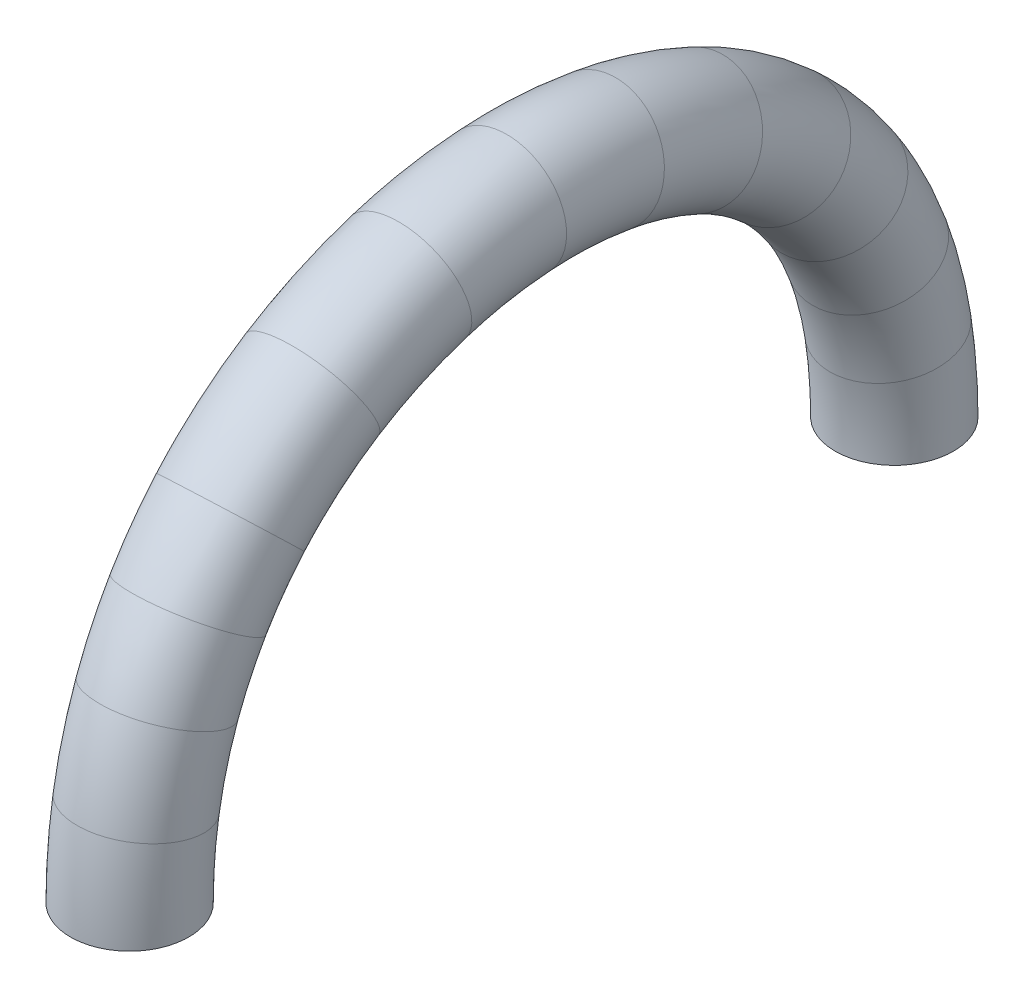
ISO-10303-21;
HEADER;
FILE_DESCRIPTION(('STEP AP214'),'2;1');
FILE_NAME('part.step','',(''),(''),'','','');
FILE_SCHEMA(('AUTOMOTIVE_DESIGN { 1 0 10303 214 1 1 1 1 }'));
ENDSEC;
DATA;
#1=APPLICATION_CONTEXT('core data for automotive mechanical design processes');
#2=APPLICATION_PROTOCOL_DEFINITION('international standard','automotive_design',2000,#1);
#3=PRODUCT_CONTEXT('',#1,'mechanical');
#4=PRODUCT('Part','Part','',(#3));
#5=PRODUCT_RELATED_PRODUCT_CATEGORY('part','',(#4));
#6=PRODUCT_DEFINITION_FORMATION('','',#4);
#7=PRODUCT_DEFINITION_CONTEXT('part definition',#1,'design');
#8=PRODUCT_DEFINITION('design','',#6,#7);
#9=PRODUCT_DEFINITION_SHAPE('','',#8);
#10=(LENGTH_UNIT() NAMED_UNIT(*) SI_UNIT(.MILLI.,.METRE.));
#11=(NAMED_UNIT(*) PLANE_ANGLE_UNIT() SI_UNIT($,.RADIAN.));
#12=(NAMED_UNIT(*) SI_UNIT($,.STERADIAN.) SOLID_ANGLE_UNIT());
#13=UNCERTAINTY_MEASURE_WITH_UNIT(LENGTH_MEASURE(1.E-05),#10,'distance_accuracy_value','');
#14=(GEOMETRIC_REPRESENTATION_CONTEXT(3) GLOBAL_UNCERTAINTY_ASSIGNED_CONTEXT((#13)) GLOBAL_UNIT_ASSIGNED_CONTEXT((#10,
#11,#12)) REPRESENTATION_CONTEXT('',''));
#15=CARTESIAN_POINT('',(0.,0.,0.));
#16=DIRECTION('',(0.,0.,1.));
#17=DIRECTION('',(1.,0.,0.));
#18=AXIS2_PLACEMENT_3D('',#15,#16,#17);
#19=CARTESIAN_POINT('',(-5.24968353162595,125.049999999714,248.374757540876));
#20=DIRECTION('',(0.,1.,0.));
#21=DIRECTION('',(0.,0.,-1.));
#22=AXIS2_PLACEMENT_3D('',#19,#20,#21);
#23=PLANE('',#22);
#24=CARTESIAN_POINT('',(-5.24968353162595,125.049999999714,248.374757540876));
#25=DIRECTION('',(0.,1.,0.));
#26=DIRECTION('',(0.,0.,1.));
#27=AXIS2_PLACEMENT_3D('',#24,#25,#26);
#28=CIRCLE('',#27,0.77);
#29=CARTESIAN_POINT('',(-5.24968353162595,125.049999999714,249.144757540876));
#30=VERTEX_POINT('',#29);
#31=EDGE_CURVE('E11',#30,#30,#28,.T.);
#32=ORIENTED_EDGE('',*,*,#31,.F.);
#33=EDGE_LOOP('',(#32));
#34=FACE_BOUND('',#33,.T.);
#35=ADVANCED_FACE('F43',(#34),#23,.F.);
#36=CARTESIAN_POINT('',(-4.74999999999908,125.049999999714,258.824757540733));
#37=DIRECTION('',(0.,-1.,0.));
#38=DIRECTION('',(0.,0.,-1.));
#39=AXIS2_PLACEMENT_3D('',#36,#37,#38);
#40=PLANE('',#39);
#41=CARTESIAN_POINT('',(-4.74999999999908,125.049999999714,258.824757540733));
#42=DIRECTION('',(0.,-1.,0.));
#43=DIRECTION('',(-0.0954150521681491,0.,-0.995437576053742));
#44=AXIS2_PLACEMENT_3D('',#41,#42,#43);
#45=CIRCLE('',#44,0.77);
#46=CARTESIAN_POINT('',(-4.82346959016856,125.049999999714,258.058270607171));
#47=VERTEX_POINT('',#46);
#48=EDGE_CURVE('E101',#47,#47,#45,.T.);
#49=ORIENTED_EDGE('',*,*,#48,.T.);
#50=EDGE_LOOP('',(#49));
#51=FACE_BOUND('',#50,.T.);
#52=ADVANCED_FACE('F152',(#51),#40,.T.);
#53=CARTESIAN_POINT('',(-4.93879007433618,125.049999999714,254.876546018987));
#54=DIRECTION('',(-0.998858742779414,0.,0.047762034851219));
#55=DIRECTION('',(-0.0477620348512189,0.,-0.998858742779414));
#56=AXIS2_PLACEMENT_3D('',#53,#54,#55);
#57=TOROIDAL_SURFACE('',#56,6.50921716920588,0.77);
#58=ORIENTED_EDGE('',*,*,#31,.T.);
#59=EDGE_LOOP('',(#58));
#60=FACE_BOUND('',#59,.T.);
#61=CARTESIAN_POINT('',(-5.24551350802851,126.112541783809,248.461966231646));
#62=DIRECTION('',(0.00779650707659332,0.986586968944942,0.163050198360616));
#63=DIRECTION('',(-0.000639902528925623,-0.163050198360616,0.986617566911981));
#64=AXIS2_PLACEMENT_3D('',#61,#62,#63);
#65=CIRCLE('',#64,0.77);
#66=CARTESIAN_POINT('',(-5.24600623297578,125.986993131071,249.221661758169));
#67=VERTEX_POINT('',#66);
#68=EDGE_CURVE('E53',#67,#67,#65,.T.);
#69=ORIENTED_EDGE('',*,*,#68,.F.);
#70=EDGE_LOOP('',(#69));
#71=FACE_BOUND('',#70,.T.);
#72=ADVANCED_FACE('F147',(#60,#71),#57,.T.);
#73=CARTESIAN_POINT('',(-5.00029378322637,125.263059236127,253.590304393611));
#74=DIRECTION('',(0.998858742779414,0.,-0.0477620348512175));
#75=DIRECTION('',(0.0477620348512175,0.,0.998858742779414));
#76=AXIS2_PLACEMENT_3D('',#73,#74,#75);
#77=TOROIDAL_SURFACE('',#76,5.20399900227804,0.77);
#78=CARTESIAN_POINT('',(-5.23213409946634,127.139118596369,248.741772970558));
#79=DIRECTION('',(0.0172183761963776,0.932757897281692,0.360091977944243));
#80=DIRECTION('',(-0.00320795436938125,-0.360091977944243,0.932911290771511));
#81=AXIS2_PLACEMENT_3D('',#78,#79,#80);
#82=CIRCLE('',#81,0.77);
#83=CARTESIAN_POINT('',(-5.23460422433076,126.861847773352,249.460114664453));
#84=VERTEX_POINT('',#83);
#85=EDGE_CURVE('E120',#84,#84,#82,.T.);
#86=ORIENTED_EDGE('',*,*,#85,.F.);
#87=EDGE_LOOP('',(#86));
#88=FACE_BOUND('',#87,.T.);
#89=ORIENTED_EDGE('',*,*,#68,.T.);
#90=EDGE_LOOP('',(#89));
#91=FACE_BOUND('',#90,.T.);
#92=ADVANCED_FACE('F141',(#88,#91),#77,.T.);
#93=CARTESIAN_POINT('',(-5.01765005362938,125.403506739291,253.227328601475));
#94=DIRECTION('',(0.998858742779413,0.,-0.0477620348512268));
#95=DIRECTION('',(0.0477620348512268,0.,0.998858742779413));
#96=AXIS2_PLACEMENT_3D('',#93,#94,#95);
#97=TOROIDAL_SURFACE('',#96,4.81441182725285,0.77);
#98=CARTESIAN_POINT('',(-5.20792832750184,128.106699598488,249.247994010508));
#99=DIRECTION('',(0.0268173966380888,0.827490743859725,0.560838565064882));
#100=DIRECTION('',(-0.00822998983705703,-0.560838565064882,0.827884274040307));
#101=AXIS2_PLACEMENT_3D('',#98,#99,#100);
#102=CIRCLE('',#101,0.77);
#103=CARTESIAN_POINT('',(-5.21426541967637,127.674853903388,249.885464901519));
#104=VERTEX_POINT('',#103);
#105=EDGE_CURVE('E47',#104,#104,#102,.T.);
#106=ORIENTED_EDGE('',*,*,#105,.F.);
#107=EDGE_LOOP('',(#106));
#108=FACE_BOUND('',#107,.T.);
#109=ORIENTED_EDGE('',*,*,#85,.T.);
#110=EDGE_LOOP('',(#109));
#111=FACE_BOUND('',#110,.T.);
#112=ADVANCED_FACE('F136',(#108,#111),#97,.T.);
#113=CARTESIAN_POINT('',(-5.02390569919261,125.492377717947,253.096502804752));
#114=DIRECTION('',(0.998858742779414,0.,-0.0477620348512201));
#115=DIRECTION('',(0.0477620348512201,0.,0.998858742779414));
#116=AXIS2_PLACEMENT_3D('',#113,#114,#115);
#117=TOROIDAL_SURFACE('',#116,4.65613178101523,0.77);
#118=CARTESIAN_POINT('',(-5.17379235828874,128.932041186004,249.961887616548));
#119=DIRECTION('',(0.0352836504988217,0.673992237637731,0.737895336488557));
#120=DIRECTION('',(-0.0155530238265091,-0.737895336488557,0.674735930448565));
#121=AXIS2_PLACEMENT_3D('',#118,#119,#120);
#122=CIRCLE('',#121,0.77);
#123=CARTESIAN_POINT('',(-5.18576818663515,128.363861776908,250.481434282993));
#124=VERTEX_POINT('',#123);
#125=EDGE_CURVE('E104',#124,#124,#122,.T.);
#126=ORIENTED_EDGE('',*,*,#125,.F.);
#127=EDGE_LOOP('',(#126));
#128=FACE_BOUND('',#127,.T.);
#129=ORIENTED_EDGE('',*,*,#105,.T.);
#130=EDGE_LOOP('',(#129));
#131=FACE_BOUND('',#130,.T.);
#132=ADVANCED_FACE('F45',(#128,#131),#117,.T.);
#133=CARTESIAN_POINT('',(-5.01684522330669,125.330350883015,253.244160208563));
#134=DIRECTION('',(0.998858742779414,0.,-0.0477620348512181));
#135=DIRECTION('',(0.0477620348512181,0.,0.998858742779414));
#136=AXIS2_PLACEMENT_3D('',#133,#134,#135);
#137=TOROIDAL_SURFACE('',#136,4.87546088181558,0.77);
#138=CARTESIAN_POINT('',(-5.11995137720517,129.701841452362,251.08787680111));
#139=DIRECTION('',(0.0428249328599185,0.442778056370422,0.895607959948087));
#140=DIRECTION('',(-0.0265836804103278,-0.895607959948087,0.44404919773992));
#141=AXIS2_PLACEMENT_3D('',#138,#139,#140);
#142=CIRCLE('',#141,0.77);
#143=CARTESIAN_POINT('',(-5.14042081112112,129.012223323202,251.42979468337));
#144=VERTEX_POINT('',#143);
#145=EDGE_CURVE('E106',#144,#144,#142,.T.);
#146=ORIENTED_EDGE('',*,*,#145,.F.);
#147=EDGE_LOOP('',(#146));
#148=FACE_BOUND('',#147,.T.);
#149=ORIENTED_EDGE('',*,*,#125,.T.);
#150=EDGE_LOOP('',(#149));
#151=FACE_BOUND('',#150,.T.);
#152=ADVANCED_FACE('F128',(#148,#151),#137,.T.);
#153=CARTESIAN_POINT('',(-5.00256428061136,124.724868048542,253.542820944245));
#154=DIRECTION('',(0.998858742779414,0.,-0.0477620348512213));
#155=DIRECTION('',(0.0477620348512213,0.,0.998858742779414));
#156=AXIS2_PLACEMENT_3D('',#153,#154,#155);
#157=TOROIDAL_SURFACE('',#156,5.55074722345489,0.77);
#158=CARTESIAN_POINT('',(-5.05824318870631,130.151819886566,252.378394756954));
#159=DIRECTION('',(0.0466968233985397,0.210017961279175,0.976581723474602));
#160=DIRECTION('',(-0.0376880887182245,-0.976581723474602,0.211820077764462));
#161=AXIS2_PLACEMENT_3D('',#158,#159,#160);
#162=CIRCLE('',#161,0.77);
#163=CARTESIAN_POINT('',(-5.08726301701934,129.399851959491,252.541496216833));
#164=VERTEX_POINT('',#163);
#165=EDGE_CURVE('E113',#164,#164,#162,.T.);
#166=ORIENTED_EDGE('',*,*,#165,.F.);
#167=EDGE_LOOP('',(#166));
#168=FACE_BOUND('',#167,.T.);
#169=ORIENTED_EDGE('',*,*,#145,.T.);
#170=EDGE_LOOP('',(#169));
#171=FACE_BOUND('',#170,.T.);
#172=ADVANCED_FACE('F126',(#168,#171),#157,.T.);
#173=CARTESIAN_POINT('',(-4.99974090112095,124.449676866832,253.60186694798));
#174=DIRECTION('',(0.998858742779414,0.,-0.0477620348512187));
#175=DIRECTION('',(0.0477620348512187,0.,0.998858742779414));
#176=AXIS2_PLACEMENT_3D('',#173,#174,#175);
#177=TOROIDAL_SURFACE('',#176,5.83221585140429,0.77);
#178=CARTESIAN_POINT('',(-4.9950802384124,130.281076330413,253.699336490642));
#179=DIRECTION('',(0.0477553491686805,-0.01673136078347,0.998718923517579));
#180=DIRECTION('',(-0.0485057379150768,-0.998718923517579,-0.0144119810297948));
#181=AXIS2_PLACEMENT_3D('',#178,#179,#180);
#182=CIRCLE('',#181,0.77);
#183=CARTESIAN_POINT('',(-5.03242965660701,129.512062759304,253.688239265249));
#184=VERTEX_POINT('',#183);
#185=EDGE_CURVE('E115',#184,#184,#182,.T.);
#186=ORIENTED_EDGE('',*,*,#185,.F.);
#187=EDGE_LOOP('',(#186));
#188=FACE_BOUND('',#187,.T.);
#189=ORIENTED_EDGE('',*,*,#165,.T.);
#190=EDGE_LOOP('',(#189));
#191=FACE_BOUND('',#190,.T.);
#192=ADVANCED_FACE('F168',(#188,#191),#177,.T.);
#193=CARTESIAN_POINT('',(-4.99970677652989,124.492373396073,253.60258060363));
#194=DIRECTION('',(0.998858742779414,0.,-0.0477620348512183));
#195=DIRECTION('',(0.0477620348512183,0.,0.998858742779414));
#196=AXIS2_PLACEMENT_3D('',#193,#194,#195);
#197=TOROIDAL_SURFACE('',#196,5.78951334470883,0.77);
#198=CARTESIAN_POINT('',(-4.9321721853529,130.106562883694,255.014947498117));
#199=DIRECTION('',(0.0463156569479496,-0.244231341371763,0.968610299250028));
#200=DIRECTION('',(-0.0593591991731181,-0.968610299250028,-0.241392985938484));
#201=AXIS2_PLACEMENT_3D('',#198,#199,#200);
#202=CIRCLE('',#201,0.77);
#203=CARTESIAN_POINT('',(-4.9778787687162,129.360732953271,254.829074898945));
#204=VERTEX_POINT('',#203);
#205=EDGE_CURVE('E112',#204,#204,#202,.T.);
#206=ORIENTED_EDGE('',*,*,#205,.F.);
#207=EDGE_LOOP('',(#206));
#208=FACE_BOUND('',#207,.T.);
#209=ORIENTED_EDGE('',*,*,#185,.T.);
#210=EDGE_LOOP('',(#209));
#211=FACE_BOUND('',#210,.T.);
#212=ADVANCED_FACE('F181',(#208,#211),#197,.T.);
#213=CARTESIAN_POINT('',(-4.99592597962249,124.80667322202,253.681649304481));
#214=DIRECTION('',(0.998858742779414,0.,-0.0477620348512209));
#215=DIRECTION('',(0.0477620348512209,0.,0.998858742779414));
#216=AXIS2_PLACEMENT_3D('',#213,#214,#215);
#217=TOROIDAL_SURFACE('',#216,5.4653983427883,0.77);
#218=CARTESIAN_POINT('',(-4.86936656842348,129.586755499415,256.328416234553));
#219=DIRECTION('',(0.0417730679458901,-0.484830355816042,0.873610059965931));
#220=DIRECTION('',(-0.0708375829305219,-0.873610059965932,-0.481443143030289));
#221=AXIS2_PLACEMENT_3D('',#218,#219,#220);
#222=CIRCLE('',#221,0.77);
#223=CARTESIAN_POINT('',(-4.92391150727998,128.914075753242,255.95770501442));
#224=VERTEX_POINT('',#223);
#225=EDGE_CURVE('E99',#224,#224,#222,.T.);
#226=ORIENTED_EDGE('',*,*,#225,.F.);
#227=EDGE_LOOP('',(#226));
#228=FACE_BOUND('',#227,.T.);
#229=ORIENTED_EDGE('',*,*,#205,.T.);
#230=EDGE_LOOP('',(#229));
#231=FACE_BOUND('',#230,.T.);
#232=ADVANCED_FACE('F178',(#228,#231),#217,.T.);
#233=CARTESIAN_POINT('',(-4.98036781917106,125.394296744747,254.007020797486));
#234=DIRECTION('',(0.998858742779414,0.,-0.0477620348512223));
#235=DIRECTION('',(0.0477620348512223,0.,0.998858742779414));
#236=AXIS2_PLACEMENT_3D('',#233,#234,#235);
#237=TOROIDAL_SURFACE('',#236,4.79352776799105,0.77);
#238=CARTESIAN_POINT('',(-4.81589409104346,128.728883975355,257.446698813917));
#239=DIRECTION('',(0.0332253570295924,-0.718387005492694,0.694849757853809));
#240=DIRECTION('',(-0.081979992887081,-0.694849757853809,-0.714467000481294));
#241=AXIS2_PLACEMENT_3D('',#238,#239,#240);
#242=CIRCLE('',#241,0.77);
#243=CARTESIAN_POINT('',(-4.87901868556651,128.193849661808,256.896559223546));
#244=VERTEX_POINT('',#243);
#245=EDGE_CURVE('E97',#244,#244,#242,.T.);
#246=ORIENTED_EDGE('',*,*,#245,.F.);
#247=EDGE_LOOP('',(#246));
#248=FACE_BOUND('',#247,.T.);
#249=ORIENTED_EDGE('',*,*,#225,.T.);
#250=EDGE_LOOP('',(#249));
#251=FACE_BOUND('',#250,.T.);
#252=ADVANCED_FACE('F175',(#248,#251),#237,.T.);
#253=CARTESIAN_POINT('',(-4.97513585006973,125.500371177151,254.116438206));
#254=DIRECTION('',(0.998858742779414,0.,-0.0477620348512181));
#255=DIRECTION('',(0.0477620348512181,0.,0.998858742779414));
#256=AXIS2_PLACEMENT_3D('',#253,#254,#255);
#257=TOROIDAL_SURFACE('',#256,4.64104390656128,0.77);
#258=CARTESIAN_POINT('',(-4.78820614512257,127.99470051929,258.025743382241));
#259=DIRECTION('',(0.0256697086621663,-0.843295576460508,0.536836694702718));
#260=DIRECTION('',(-0.0879390717946537,-0.536836694702718,-0.83909062852147));
#261=AXIS2_PLACEMENT_3D('',#258,#259,#260);
#262=CIRCLE('',#261,0.77);
#263=CARTESIAN_POINT('',(-4.85591923040445,127.581336264369,257.379643598279));
#264=VERTEX_POINT('',#263);
#265=EDGE_CURVE('E94',#264,#264,#262,.T.);
#266=ORIENTED_EDGE('',*,*,#265,.F.);
#267=EDGE_LOOP('',(#266));
#268=FACE_BOUND('',#267,.T.);
#269=ORIENTED_EDGE('',*,*,#245,.T.);
#270=EDGE_LOOP('',(#269));
#271=FACE_BOUND('',#270,.T.);
#272=ADVANCED_FACE('F173',(#268,#271),#257,.T.);
#273=CARTESIAN_POINT('',(-4.98280047731182,125.398096877664,253.956146041841));
#274=DIRECTION('',(0.998858742779414,0.,-0.0477620348512119));
#275=DIRECTION('',(0.0477620348512119,0.,0.998858742779414));
#276=AXIS2_PLACEMENT_3D('',#273,#274,#275);
#277=TOROIDAL_SURFACE('',#276,4.83133935247926,0.77);
#278=CARTESIAN_POINT('',(-4.76794720651944,127.160520475433,258.449423361668));
#279=DIRECTION('',(0.0174231059253,-0.931089877124918,0.364373539236072));
#280=DIRECTION('',(-0.0921275206836303,-0.364373539236073,-0.926684651776032));
#281=AXIS2_PLACEMENT_3D('',#278,#279,#280);
#282=CIRCLE('',#281,0.77);
#283=CARTESIAN_POINT('',(-4.83888539744584,126.879952850221,257.7358761798));
#284=VERTEX_POINT('',#283);
#285=EDGE_CURVE('E98',#284,#284,#282,.T.);
#286=ORIENTED_EDGE('',*,*,#285,.F.);
#287=EDGE_LOOP('',(#286));
#288=FACE_BOUND('',#287,.T.);
#289=ORIENTED_EDGE('',*,*,#265,.T.);
#290=EDGE_LOOP('',(#289));
#291=FACE_BOUND('',#290,.T.);
#292=ADVANCED_FACE('F95',(#288,#291),#277,.T.);
#293=CARTESIAN_POINT('',(-4.99881869831932,125.266700736503,253.621153193506));
#294=DIRECTION('',(0.998858742779414,0.,-0.0477620348512183));
#295=DIRECTION('',(0.0477620348512183,0.,0.998858742779414));
#296=AXIS2_PLACEMENT_3D('',#293,#294,#295);
#297=TOROIDAL_SURFACE('',#296,5.19153615667334,0.77);
#298=CARTESIAN_POINT('',(-4.75426366227697,126.123888524242,258.735590562069));
#299=DIRECTION('',(0.00788611150081986,-0.986274730950037,0.16492411689874));
#300=DIRECTION('',(-0.0947602535369396,-0.16492411689874,-0.98174361725187));
#301=AXIS2_PLACEMENT_3D('',#298,#299,#300);
#302=CIRCLE('',#301,0.77);
#303=CARTESIAN_POINT('',(-4.82722905750041,125.99689695423,257.979647976785));
#304=VERTEX_POINT('',#303);
#305=EDGE_CURVE('E108',#304,#304,#302,.T.);
#306=ORIENTED_EDGE('',*,*,#305,.F.);
#307=EDGE_LOOP('',(#306));
#308=FACE_BOUND('',#307,.T.);
#309=ORIENTED_EDGE('',*,*,#285,.T.);
#310=EDGE_LOOP('',(#309));
#311=FACE_BOUND('',#310,.T.);
#312=ADVANCED_FACE('F172',(#308,#311),#297,.T.);
#313=CARTESIAN_POINT('',(-5.06064325678073,125.049999999714,252.328201565084));
#314=DIRECTION('',(0.998858742779414,0.,-0.0477620348512183));
#315=DIRECTION('',(0.0477620348512183,0.,0.998858742779414));
#316=AXIS2_PLACEMENT_3D('',#313,#314,#315);
#317=TOROIDAL_SURFACE('',#316,6.50397868828924,0.77);
#318=ORIENTED_EDGE('',*,*,#48,.F.);
#319=EDGE_LOOP('',(#318));
#320=FACE_BOUND('',#319,.T.);
#321=ORIENTED_EDGE('',*,*,#305,.T.);
#322=EDGE_LOOP('',(#321));
#323=FACE_BOUND('',#322,.T.);
#324=ADVANCED_FACE('F187',(#320,#323),#317,.T.);
#325=CLOSED_SHELL('',(#35,#52,#72,#92,#112,#132,#152,#172,#192,#212,#232,#252,#272,#292,#312,#324));
#326=MANIFOLD_SOLID_BREP('B2',#325);
#327=ADVANCED_BREP_SHAPE_REPRESENTATION('',(#18,#326),#14);
#328=SHAPE_DEFINITION_REPRESENTATION(#9,#327);
ENDSEC;
END-ISO-10303-21;
